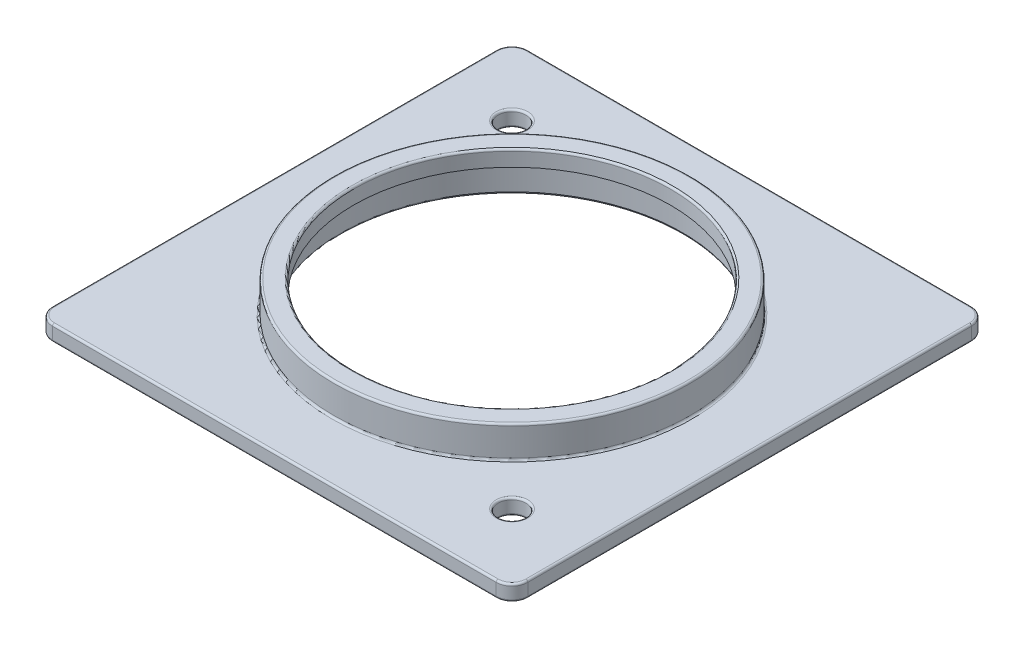
ISO-10303-21;
HEADER;
FILE_DESCRIPTION(('STEP AP214'),'2;1');
FILE_NAME('part.step','',(''),(''),'','','');
FILE_SCHEMA(('AUTOMOTIVE_DESIGN { 1 0 10303 214 1 1 1 1 }'));
ENDSEC;
DATA;
#1=APPLICATION_CONTEXT('core data for automotive mechanical design processes');
#2=APPLICATION_PROTOCOL_DEFINITION('international standard','automotive_design',2000,#1);
#3=PRODUCT_CONTEXT('',#1,'mechanical');
#4=PRODUCT('Part','Part','',(#3));
#5=PRODUCT_RELATED_PRODUCT_CATEGORY('part','',(#4));
#6=PRODUCT_DEFINITION_FORMATION('','',#4);
#7=PRODUCT_DEFINITION_CONTEXT('part definition',#1,'design');
#8=PRODUCT_DEFINITION('design','',#6,#7);
#9=PRODUCT_DEFINITION_SHAPE('','',#8);
#10=(LENGTH_UNIT() NAMED_UNIT(*) SI_UNIT(.MILLI.,.METRE.));
#11=(NAMED_UNIT(*) PLANE_ANGLE_UNIT() SI_UNIT($,.RADIAN.));
#12=(NAMED_UNIT(*) SI_UNIT($,.STERADIAN.) SOLID_ANGLE_UNIT());
#13=UNCERTAINTY_MEASURE_WITH_UNIT(LENGTH_MEASURE(1.E-05),#10,'distance_accuracy_value','');
#14=(GEOMETRIC_REPRESENTATION_CONTEXT(3) GLOBAL_UNCERTAINTY_ASSIGNED_CONTEXT((#13)) GLOBAL_UNIT_ASSIGNED_CONTEXT((#10,
#11,#12)) REPRESENTATION_CONTEXT('',''));
#15=CARTESIAN_POINT('',(0.,0.,0.));
#16=DIRECTION('',(0.,0.,1.));
#17=DIRECTION('',(1.,0.,0.));
#18=AXIS2_PLACEMENT_3D('',#15,#16,#17);
#19=CARTESIAN_POINT('',(0.,2.,0.));
#20=DIRECTION('',(0.,1.,0.));
#21=DIRECTION('',(0.,0.,1.));
#22=AXIS2_PLACEMENT_3D('',#19,#20,#21);
#23=PLANE('',#22);
#24=CARTESIAN_POINT('',(-21.2132034355966,2.,-21.2132034355962));
#25=DIRECTION('',(0.,1.,0.));
#26=DIRECTION('',(0.,0.,1.));
#27=AXIS2_PLACEMENT_3D('',#24,#25,#26);
#28=CIRCLE('',#27,2.00000000000002);
#29=CARTESIAN_POINT('',(-21.2132034355966,2.,-19.2132034355962));
#30=VERTEX_POINT('',#29);
#31=EDGE_CURVE('E259',#30,#30,#28,.F.);
#32=ORIENTED_EDGE('',*,*,#31,.T.);
#33=EDGE_LOOP('',(#32));
#34=FACE_BOUND('',#33,.T.);
#35=CARTESIAN_POINT('',(21.2132034355966,2.,21.2132034355962));
#36=DIRECTION('',(0.,1.,0.));
#37=DIRECTION('',(0.,0.,1.));
#38=AXIS2_PLACEMENT_3D('',#35,#36,#37);
#39=CIRCLE('',#38,2.);
#40=CARTESIAN_POINT('',(21.2132034355966,2.,23.2132034355962));
#41=VERTEX_POINT('',#40);
#42=EDGE_CURVE('E262',#41,#41,#39,.F.);
#43=ORIENTED_EDGE('',*,*,#42,.T.);
#44=EDGE_LOOP('',(#43));
#45=FACE_BOUND('',#44,.T.);
#46=CARTESIAN_POINT('',(0.,2.,0.));
#47=DIRECTION('',(0.,1.,0.));
#48=DIRECTION('',(0.,0.,1.));
#49=AXIS2_PLACEMENT_3D('',#46,#47,#48);
#50=CIRCLE('',#49,22.75);
#51=CARTESIAN_POINT('',(0.,2.,22.75));
#52=VERTEX_POINT('',#51);
#53=EDGE_CURVE('E357',#52,#52,#50,.F.);
#54=ORIENTED_EDGE('',*,*,#53,.T.);
#55=EDGE_LOOP('',(#54));
#56=FACE_BOUND('',#55,.T.);
#57=CARTESIAN_POINT('',(-28.,2.,28.));
#58=DIRECTION('',(0.,1.,0.));
#59=DIRECTION('',(0.,0.,1.));
#60=AXIS2_PLACEMENT_3D('',#57,#58,#59);
#61=CIRCLE('',#60,1.75);
#62=CARTESIAN_POINT('',(-28.,2.,29.75));
#63=VERTEX_POINT('',#62);
#64=CARTESIAN_POINT('',(-29.75,2.,28.));
#65=VERTEX_POINT('',#64);
#66=EDGE_CURVE('E260',#63,#65,#61,.F.);
#67=ORIENTED_EDGE('',*,*,#66,.F.);
#68=DIRECTION('',(1.,0.,0.));
#69=VECTOR('',#68,1.);
#70=CARTESIAN_POINT('',(30.,2.,29.75));
#71=LINE('',#70,#69);
#72=CARTESIAN_POINT('',(28.,2.,29.75));
#73=VERTEX_POINT('',#72);
#74=EDGE_CURVE('E250',#63,#73,#71,.T.);
#75=ORIENTED_EDGE('',*,*,#74,.T.);
#76=CARTESIAN_POINT('',(28.,2.,28.));
#77=DIRECTION('',(0.,1.,0.));
#78=DIRECTION('',(0.,0.,1.));
#79=AXIS2_PLACEMENT_3D('',#76,#77,#78);
#80=CIRCLE('',#79,1.75);
#81=CARTESIAN_POINT('',(29.75,2.,28.));
#82=VERTEX_POINT('',#81);
#83=EDGE_CURVE('E247',#82,#73,#80,.F.);
#84=ORIENTED_EDGE('',*,*,#83,.F.);
#85=DIRECTION('',(0.,0.,-1.));
#86=VECTOR('',#85,1.);
#87=CARTESIAN_POINT('',(29.75,2.,-30.));
#88=LINE('',#87,#86);
#89=CARTESIAN_POINT('',(29.75,2.,-28.));
#90=VERTEX_POINT('',#89);
#91=EDGE_CURVE('E256',#82,#90,#88,.T.);
#92=ORIENTED_EDGE('',*,*,#91,.T.);
#93=CARTESIAN_POINT('',(28.,2.,-28.));
#94=DIRECTION('',(0.,1.,0.));
#95=DIRECTION('',(0.,0.,1.));
#96=AXIS2_PLACEMENT_3D('',#93,#94,#95);
#97=CIRCLE('',#96,1.75);
#98=CARTESIAN_POINT('',(28.,2.,-29.75));
#99=VERTEX_POINT('',#98);
#100=EDGE_CURVE('E281',#99,#90,#97,.F.);
#101=ORIENTED_EDGE('',*,*,#100,.F.);
#102=DIRECTION('',(1.,0.,0.));
#103=VECTOR('',#102,1.);
#104=CARTESIAN_POINT('',(0.,2.,-29.75));
#105=LINE('',#104,#103);
#106=CARTESIAN_POINT('',(-28.,2.,-29.75));
#107=VERTEX_POINT('',#106);
#108=EDGE_CURVE('E261',#99,#107,#105,.F.);
#109=ORIENTED_EDGE('',*,*,#108,.T.);
#110=CARTESIAN_POINT('',(-28.,2.,-28.));
#111=DIRECTION('',(0.,1.,0.));
#112=DIRECTION('',(0.,0.,1.));
#113=AXIS2_PLACEMENT_3D('',#110,#111,#112);
#114=CIRCLE('',#113,1.75);
#115=CARTESIAN_POINT('',(-29.75,2.,-28.));
#116=VERTEX_POINT('',#115);
#117=EDGE_CURVE('E286',#116,#107,#114,.F.);
#118=ORIENTED_EDGE('',*,*,#117,.F.);
#119=DIRECTION('',(0.,0.,-1.));
#120=VECTOR('',#119,1.);
#121=CARTESIAN_POINT('',(-29.75,2.,0.));
#122=LINE('',#121,#120);
#123=EDGE_CURVE('E269',#116,#65,#122,.F.);
#124=ORIENTED_EDGE('',*,*,#123,.T.);
#125=EDGE_LOOP('',(#67,#75,#84,#92,#101,#109,#118,#124));
#126=FACE_BOUND('',#125,.T.);
#127=ADVANCED_FACE('F43',(#34,#45,#56,#126),#23,.T.);
#128=CARTESIAN_POINT('',(0.,0.,0.));
#129=DIRECTION('',(0.,1.,0.));
#130=DIRECTION('',(0.,0.,1.));
#131=AXIS2_PLACEMENT_3D('',#128,#129,#130);
#132=PLANE('',#131);
#133=CARTESIAN_POINT('',(-21.2132034355966,0.,-21.2132034355962));
#134=DIRECTION('',(0.,1.,0.));
#135=DIRECTION('',(0.,0.,1.));
#136=AXIS2_PLACEMENT_3D('',#133,#134,#135);
#137=CIRCLE('',#136,2.00000000000002);
#138=CARTESIAN_POINT('',(-21.2132034355966,0.,-19.2132034355962));
#139=VERTEX_POINT('',#138);
#140=EDGE_CURVE('E428',#139,#139,#137,.T.);
#141=ORIENTED_EDGE('',*,*,#140,.T.);
#142=EDGE_LOOP('',(#141));
#143=FACE_BOUND('',#142,.T.);
#144=CARTESIAN_POINT('',(21.2132034355966,0.,21.2132034355962));
#145=DIRECTION('',(0.,1.,0.));
#146=DIRECTION('',(0.,0.,1.));
#147=AXIS2_PLACEMENT_3D('',#144,#145,#146);
#148=CIRCLE('',#147,2.);
#149=CARTESIAN_POINT('',(21.2132034355966,0.,23.2132034355962));
#150=VERTEX_POINT('',#149);
#151=EDGE_CURVE('E433',#150,#150,#148,.T.);
#152=ORIENTED_EDGE('',*,*,#151,.T.);
#153=EDGE_LOOP('',(#152));
#154=FACE_BOUND('',#153,.T.);
#155=CARTESIAN_POINT('',(0.,0.,0.));
#156=DIRECTION('',(0.,1.,0.));
#157=DIRECTION('',(0.,0.,1.));
#158=AXIS2_PLACEMENT_3D('',#155,#156,#157);
#159=CIRCLE('',#158,21.75);
#160=CARTESIAN_POINT('',(0.,0.,21.75));
#161=VERTEX_POINT('',#160);
#162=EDGE_CURVE('E436',#161,#161,#159,.T.);
#163=ORIENTED_EDGE('',*,*,#162,.T.);
#164=EDGE_LOOP('',(#163));
#165=FACE_BOUND('',#164,.T.);
#166=CARTESIAN_POINT('',(-28.,0.,28.));
#167=DIRECTION('',(0.,1.,0.));
#168=DIRECTION('',(0.,0.,1.));
#169=AXIS2_PLACEMENT_3D('',#166,#167,#168);
#170=CIRCLE('',#169,1.75);
#171=CARTESIAN_POINT('',(-29.75,0.,28.));
#172=VERTEX_POINT('',#171);
#173=CARTESIAN_POINT('',(-28.,0.,29.75));
#174=VERTEX_POINT('',#173);
#175=EDGE_CURVE('E168',#172,#174,#170,.T.);
#176=ORIENTED_EDGE('',*,*,#175,.F.);
#177=DIRECTION('',(0.,0.,-1.));
#178=VECTOR('',#177,1.);
#179=CARTESIAN_POINT('',(-29.75,0.,-30.));
#180=LINE('',#179,#178);
#181=CARTESIAN_POINT('',(-29.75,0.,-28.));
#182=VERTEX_POINT('',#181);
#183=EDGE_CURVE('E164',#172,#182,#180,.T.);
#184=ORIENTED_EDGE('',*,*,#183,.T.);
#185=CARTESIAN_POINT('',(-28.,0.,-28.));
#186=DIRECTION('',(0.,1.,0.));
#187=DIRECTION('',(0.,0.,1.));
#188=AXIS2_PLACEMENT_3D('',#185,#186,#187);
#189=CIRCLE('',#188,1.75);
#190=CARTESIAN_POINT('',(-28.,0.,-29.75));
#191=VERTEX_POINT('',#190);
#192=EDGE_CURVE('E157',#191,#182,#189,.T.);
#193=ORIENTED_EDGE('',*,*,#192,.F.);
#194=DIRECTION('',(1.,0.,0.));
#195=VECTOR('',#194,1.);
#196=CARTESIAN_POINT('',(30.,0.,-29.75));
#197=LINE('',#196,#195);
#198=CARTESIAN_POINT('',(28.,0.,-29.75));
#199=VERTEX_POINT('',#198);
#200=EDGE_CURVE('E162',#191,#199,#197,.T.);
#201=ORIENTED_EDGE('',*,*,#200,.T.);
#202=CARTESIAN_POINT('',(28.,0.,-28.));
#203=DIRECTION('',(0.,1.,0.));
#204=DIRECTION('',(0.,0.,1.));
#205=AXIS2_PLACEMENT_3D('',#202,#203,#204);
#206=CIRCLE('',#205,1.75);
#207=CARTESIAN_POINT('',(29.75,0.,-28.));
#208=VERTEX_POINT('',#207);
#209=EDGE_CURVE('E173',#208,#199,#206,.T.);
#210=ORIENTED_EDGE('',*,*,#209,.F.);
#211=DIRECTION('',(0.,0.,-1.));
#212=VECTOR('',#211,1.);
#213=CARTESIAN_POINT('',(29.75,0.,0.));
#214=LINE('',#213,#212);
#215=CARTESIAN_POINT('',(29.75,0.,28.));
#216=VERTEX_POINT('',#215);
#217=EDGE_CURVE('E182',#208,#216,#214,.F.);
#218=ORIENTED_EDGE('',*,*,#217,.T.);
#219=CARTESIAN_POINT('',(28.,0.,28.));
#220=DIRECTION('',(0.,1.,0.));
#221=DIRECTION('',(0.,0.,1.));
#222=AXIS2_PLACEMENT_3D('',#219,#220,#221);
#223=CIRCLE('',#222,1.75);
#224=CARTESIAN_POINT('',(28.,0.,29.75));
#225=VERTEX_POINT('',#224);
#226=EDGE_CURVE('E275',#225,#216,#223,.T.);
#227=ORIENTED_EDGE('',*,*,#226,.F.);
#228=DIRECTION('',(1.,0.,0.));
#229=VECTOR('',#228,1.);
#230=CARTESIAN_POINT('',(0.,0.,29.75));
#231=LINE('',#230,#229);
#232=EDGE_CURVE('E424',#225,#174,#231,.F.);
#233=ORIENTED_EDGE('',*,*,#232,.T.);
#234=EDGE_LOOP('',(#176,#184,#193,#201,#210,#218,#227,#233));
#235=FACE_BOUND('',#234,.T.);
#236=ADVANCED_FACE('F165',(#143,#154,#165,#235),#132,.F.);
#237=CARTESIAN_POINT('',(0.,2.,30.));
#238=DIRECTION('',(0.,0.,-1.));
#239=DIRECTION('',(-1.,0.,0.));
#240=AXIS2_PLACEMENT_3D('',#237,#238,#239);
#241=PLANE('',#240);
#242=DIRECTION('',(1.,0.,0.));
#243=VECTOR('',#242,1.);
#244=CARTESIAN_POINT('',(0.,0.25,30.));
#245=LINE('',#244,#243);
#246=CARTESIAN_POINT('',(-28.,0.25,30.));
#247=VERTEX_POINT('',#246);
#248=CARTESIAN_POINT('',(28.,0.25,30.));
#249=VERTEX_POINT('',#248);
#250=EDGE_CURVE('E339',#247,#249,#245,.T.);
#251=ORIENTED_EDGE('',*,*,#250,.T.);
#252=DIRECTION('',(0.,-1.,0.));
#253=VECTOR('',#252,1.);
#254=CARTESIAN_POINT('',(28.,2.,30.));
#255=LINE('',#254,#253);
#256=CARTESIAN_POINT('',(28.,1.75,30.));
#257=VERTEX_POINT('',#256);
#258=EDGE_CURVE('E67',#249,#257,#255,.F.);
#259=ORIENTED_EDGE('',*,*,#258,.T.);
#260=DIRECTION('',(1.,0.,0.));
#261=VECTOR('',#260,1.);
#262=CARTESIAN_POINT('',(-30.,1.75,30.));
#263=LINE('',#262,#261);
#264=CARTESIAN_POINT('',(-28.,1.75,30.));
#265=VERTEX_POINT('',#264);
#266=EDGE_CURVE('E253',#257,#265,#263,.F.);
#267=ORIENTED_EDGE('',*,*,#266,.T.);
#268=DIRECTION('',(0.,-1.,0.));
#269=VECTOR('',#268,1.);
#270=CARTESIAN_POINT('',(-28.,0.25,30.));
#271=LINE('',#270,#269);
#272=EDGE_CURVE('E207',#265,#247,#271,.T.);
#273=ORIENTED_EDGE('',*,*,#272,.T.);
#274=EDGE_LOOP('',(#251,#259,#267,#273));
#275=FACE_BOUND('',#274,.T.);
#276=ADVANCED_FACE('F396',(#275),#241,.F.);
#277=CARTESIAN_POINT('',(30.,2.,0.));
#278=DIRECTION('',(-1.,0.,0.));
#279=DIRECTION('',(0.,0.,1.));
#280=AXIS2_PLACEMENT_3D('',#277,#278,#279);
#281=PLANE('',#280);
#282=DIRECTION('',(0.,0.,-1.));
#283=VECTOR('',#282,1.);
#284=CARTESIAN_POINT('',(30.,1.75,30.));
#285=LINE('',#284,#283);
#286=CARTESIAN_POINT('',(30.,1.75,-28.));
#287=VERTEX_POINT('',#286);
#288=CARTESIAN_POINT('',(30.,1.75,28.));
#289=VERTEX_POINT('',#288);
#290=EDGE_CURVE('E442',#287,#289,#285,.F.);
#291=ORIENTED_EDGE('',*,*,#290,.T.);
#292=DIRECTION('',(0.,-1.,0.));
#293=VECTOR('',#292,1.);
#294=CARTESIAN_POINT('',(30.,2.,28.));
#295=LINE('',#294,#293);
#296=CARTESIAN_POINT('',(30.,0.25,28.));
#297=VERTEX_POINT('',#296);
#298=EDGE_CURVE('E210',#289,#297,#295,.T.);
#299=ORIENTED_EDGE('',*,*,#298,.T.);
#300=DIRECTION('',(0.,0.,-1.));
#301=VECTOR('',#300,1.);
#302=CARTESIAN_POINT('',(30.,0.25,0.));
#303=LINE('',#302,#301);
#304=CARTESIAN_POINT('',(30.,0.25,-28.));
#305=VERTEX_POINT('',#304);
#306=EDGE_CURVE('E438',#297,#305,#303,.T.);
#307=ORIENTED_EDGE('',*,*,#306,.T.);
#308=DIRECTION('',(0.,-1.,0.));
#309=VECTOR('',#308,1.);
#310=CARTESIAN_POINT('',(30.,1.75,-28.));
#311=LINE('',#310,#309);
#312=EDGE_CURVE('E202',#305,#287,#311,.F.);
#313=ORIENTED_EDGE('',*,*,#312,.T.);
#314=EDGE_LOOP('',(#291,#299,#307,#313));
#315=FACE_BOUND('',#314,.T.);
#316=ADVANCED_FACE('F404',(#315),#281,.F.);
#317=CARTESIAN_POINT('',(0.,2.,-30.));
#318=DIRECTION('',(0.,0.,-1.));
#319=DIRECTION('',(-1.,0.,0.));
#320=AXIS2_PLACEMENT_3D('',#317,#318,#319);
#321=PLANE('',#320);
#322=DIRECTION('',(1.,0.,0.));
#323=VECTOR('',#322,1.);
#324=CARTESIAN_POINT('',(0.,1.75,-30.));
#325=LINE('',#324,#323);
#326=CARTESIAN_POINT('',(-28.,1.75,-30.));
#327=VERTEX_POINT('',#326);
#328=CARTESIAN_POINT('',(28.,1.75,-30.));
#329=VERTEX_POINT('',#328);
#330=EDGE_CURVE('E304',#327,#329,#325,.T.);
#331=ORIENTED_EDGE('',*,*,#330,.T.);
#332=DIRECTION('',(0.,-1.,0.));
#333=VECTOR('',#332,1.);
#334=CARTESIAN_POINT('',(28.,0.25,-30.));
#335=LINE('',#334,#333);
#336=CARTESIAN_POINT('',(28.,0.25,-30.));
#337=VERTEX_POINT('',#336);
#338=EDGE_CURVE('E212',#329,#337,#335,.T.);
#339=ORIENTED_EDGE('',*,*,#338,.T.);
#340=DIRECTION('',(1.,0.,0.));
#341=VECTOR('',#340,1.);
#342=CARTESIAN_POINT('',(-30.,0.25,-30.));
#343=LINE('',#342,#341);
#344=CARTESIAN_POINT('',(-28.,0.25,-30.));
#345=VERTEX_POINT('',#344);
#346=EDGE_CURVE('E313',#337,#345,#343,.F.);
#347=ORIENTED_EDGE('',*,*,#346,.T.);
#348=DIRECTION('',(0.,-1.,0.));
#349=VECTOR('',#348,1.);
#350=CARTESIAN_POINT('',(-28.,2.,-30.));
#351=LINE('',#350,#349);
#352=EDGE_CURVE('E215',#345,#327,#351,.F.);
#353=ORIENTED_EDGE('',*,*,#352,.T.);
#354=EDGE_LOOP('',(#331,#339,#347,#353));
#355=FACE_BOUND('',#354,.T.);
#356=ADVANCED_FACE('F306',(#355),#321,.T.);
#357=CARTESIAN_POINT('',(-21.2132034355966,2.,-21.2132034355962));
#358=DIRECTION('',(0.,-1.,0.));
#359=DIRECTION('',(0.,0.,-1.));
#360=AXIS2_PLACEMENT_3D('',#357,#358,#359);
#361=CYLINDRICAL_SURFACE('',#360,1.75000000000002);
#362=CARTESIAN_POINT('',(-21.2132034355966,0.25,-21.2132034355962));
#363=DIRECTION('',(0.,1.,0.));
#364=DIRECTION('',(0.,0.,1.));
#365=AXIS2_PLACEMENT_3D('',#362,#363,#364);
#366=CIRCLE('',#365,1.75000000000002);
#367=CARTESIAN_POINT('',(-21.2132034355966,0.25,-19.4632034355962));
#368=VERTEX_POINT('',#367);
#369=EDGE_CURVE('E345',#368,#368,#366,.F.);
#370=ORIENTED_EDGE('',*,*,#369,.T.);
#371=EDGE_LOOP('',(#370));
#372=FACE_BOUND('',#371,.T.);
#373=CARTESIAN_POINT('',(-21.2132034355966,1.75,-21.2132034355962));
#374=DIRECTION('',(0.,1.,0.));
#375=DIRECTION('',(0.,0.,1.));
#376=AXIS2_PLACEMENT_3D('',#373,#374,#375);
#377=CIRCLE('',#376,1.75000000000002);
#378=CARTESIAN_POINT('',(-21.2132034355966,1.75,-19.4632034355962));
#379=VERTEX_POINT('',#378);
#380=EDGE_CURVE('E342',#379,#379,#377,.T.);
#381=ORIENTED_EDGE('',*,*,#380,.T.);
#382=EDGE_LOOP('',(#381));
#383=FACE_BOUND('',#382,.T.);
#384=ADVANCED_FACE('F374',(#372,#383),#361,.F.);
#385=CARTESIAN_POINT('',(21.2132034355966,2.,21.2132034355962));
#386=DIRECTION('',(0.,-1.,0.));
#387=DIRECTION('',(0.,0.,-1.));
#388=AXIS2_PLACEMENT_3D('',#385,#386,#387);
#389=CYLINDRICAL_SURFACE('',#388,1.75);
#390=CARTESIAN_POINT('',(21.2132034355966,0.25,21.2132034355962));
#391=DIRECTION('',(0.,1.,0.));
#392=DIRECTION('',(0.,0.,1.));
#393=AXIS2_PLACEMENT_3D('',#390,#391,#392);
#394=CIRCLE('',#393,1.75);
#395=CARTESIAN_POINT('',(21.2132034355966,0.25,22.9632034355962));
#396=VERTEX_POINT('',#395);
#397=EDGE_CURVE('E353',#396,#396,#394,.F.);
#398=ORIENTED_EDGE('',*,*,#397,.T.);
#399=EDGE_LOOP('',(#398));
#400=FACE_BOUND('',#399,.T.);
#401=CARTESIAN_POINT('',(21.2132034355966,1.75,21.2132034355962));
#402=DIRECTION('',(0.,1.,0.));
#403=DIRECTION('',(0.,0.,1.));
#404=AXIS2_PLACEMENT_3D('',#401,#402,#403);
#405=CIRCLE('',#404,1.75);
#406=CARTESIAN_POINT('',(21.2132034355966,1.75,22.9632034355962));
#407=VERTEX_POINT('',#406);
#408=EDGE_CURVE('E346',#407,#407,#405,.T.);
#409=ORIENTED_EDGE('',*,*,#408,.T.);
#410=EDGE_LOOP('',(#409));
#411=FACE_BOUND('',#410,.T.);
#412=ADVANCED_FACE('F375',(#400,#411),#389,.F.);
#413=CARTESIAN_POINT('',(-30.,2.,0.));
#414=DIRECTION('',(-1.,0.,0.));
#415=DIRECTION('',(0.,0.,1.));
#416=AXIS2_PLACEMENT_3D('',#413,#414,#415);
#417=PLANE('',#416);
#418=DIRECTION('',(0.,0.,-1.));
#419=VECTOR('',#418,1.);
#420=CARTESIAN_POINT('',(-30.,1.75,0.));
#421=LINE('',#420,#419);
#422=CARTESIAN_POINT('',(-30.,1.75,28.));
#423=VERTEX_POINT('',#422);
#424=CARTESIAN_POINT('',(-30.,1.75,-28.));
#425=VERTEX_POINT('',#424);
#426=EDGE_CURVE('E334',#423,#425,#421,.T.);
#427=ORIENTED_EDGE('',*,*,#426,.T.);
#428=DIRECTION('',(0.,-1.,0.));
#429=VECTOR('',#428,1.);
#430=CARTESIAN_POINT('',(-30.,2.,-28.));
#431=LINE('',#430,#429);
#432=CARTESIAN_POINT('',(-30.,0.25,-28.));
#433=VERTEX_POINT('',#432);
#434=EDGE_CURVE('E11',#425,#433,#431,.T.);
#435=ORIENTED_EDGE('',*,*,#434,.T.);
#436=DIRECTION('',(0.,0.,-1.));
#437=VECTOR('',#436,1.);
#438=CARTESIAN_POINT('',(-30.,0.25,30.));
#439=LINE('',#438,#437);
#440=CARTESIAN_POINT('',(-30.,0.25,28.));
#441=VERTEX_POINT('',#440);
#442=EDGE_CURVE('E338',#433,#441,#439,.F.);
#443=ORIENTED_EDGE('',*,*,#442,.T.);
#444=DIRECTION('',(0.,-1.,0.));
#445=VECTOR('',#444,1.);
#446=CARTESIAN_POINT('',(-30.,1.75,28.));
#447=LINE('',#446,#445);
#448=EDGE_CURVE('E55',#441,#423,#447,.F.);
#449=ORIENTED_EDGE('',*,*,#448,.T.);
#450=EDGE_LOOP('',(#427,#435,#443,#449));
#451=FACE_BOUND('',#450,.T.);
#452=ADVANCED_FACE('F372',(#451),#417,.T.);
#453=CARTESIAN_POINT('',(0.,6.,0.));
#454=DIRECTION('',(0.,-1.,0.));
#455=DIRECTION('',(0.,0.,-1.));
#456=AXIS2_PLACEMENT_3D('',#453,#454,#455);
#457=CYLINDRICAL_SURFACE('',#456,20.);
#458=CARTESIAN_POINT('',(0.,5.75,0.));
#459=DIRECTION('',(0.,1.,0.));
#460=DIRECTION('',(0.,0.,1.));
#461=AXIS2_PLACEMENT_3D('',#458,#459,#460);
#462=CIRCLE('',#461,20.);
#463=CARTESIAN_POINT('',(0.,5.75,20.));
#464=VERTEX_POINT('',#463);
#465=EDGE_CURVE('E441',#464,#464,#462,.T.);
#466=ORIENTED_EDGE('',*,*,#465,.T.);
#467=EDGE_LOOP('',(#466));
#468=FACE_BOUND('',#467,.T.);
#469=CARTESIAN_POINT('',(0.,4.,0.));
#470=DIRECTION('',(0.,1.,0.));
#471=DIRECTION('',(0.,0.,1.));
#472=AXIS2_PLACEMENT_3D('',#469,#470,#471);
#473=CIRCLE('',#472,20.);
#474=CARTESIAN_POINT('',(0.,4.,20.));
#475=VERTEX_POINT('',#474);
#476=EDGE_CURVE('E221',#475,#475,#473,.T.);
#477=ORIENTED_EDGE('',*,*,#476,.F.);
#478=EDGE_LOOP('',(#477));
#479=FACE_BOUND('',#478,.T.);
#480=ADVANCED_FACE('F382',(#468,#479),#457,.F.);
#481=CARTESIAN_POINT('',(0.,6.,0.));
#482=DIRECTION('',(0.,-1.,0.));
#483=DIRECTION('',(0.,0.,-1.));
#484=AXIS2_PLACEMENT_3D('',#481,#482,#483);
#485=CYLINDRICAL_SURFACE('',#484,22.5);
#486=CARTESIAN_POINT('',(0.,5.75,0.));
#487=DIRECTION('',(0.,1.,0.));
#488=DIRECTION('',(0.,0.,1.));
#489=AXIS2_PLACEMENT_3D('',#486,#487,#488);
#490=CIRCLE('',#489,22.5);
#491=CARTESIAN_POINT('',(0.,5.75,22.5));
#492=VERTEX_POINT('',#491);
#493=EDGE_CURVE('E450',#492,#492,#490,.F.);
#494=ORIENTED_EDGE('',*,*,#493,.T.);
#495=EDGE_LOOP('',(#494));
#496=FACE_BOUND('',#495,.T.);
#497=CARTESIAN_POINT('',(0.,2.25,0.));
#498=DIRECTION('',(0.,1.,0.));
#499=DIRECTION('',(0.,0.,1.));
#500=AXIS2_PLACEMENT_3D('',#497,#498,#499);
#501=CIRCLE('',#500,22.5);
#502=CARTESIAN_POINT('',(0.,2.25,22.5));
#503=VERTEX_POINT('',#502);
#504=EDGE_CURVE('E449',#503,#503,#501,.T.);
#505=ORIENTED_EDGE('',*,*,#504,.T.);
#506=EDGE_LOOP('',(#505));
#507=FACE_BOUND('',#506,.T.);
#508=ADVANCED_FACE('F469',(#496,#507),#485,.T.);
#509=CARTESIAN_POINT('',(0.,6.,0.));
#510=DIRECTION('',(0.,1.,0.));
#511=DIRECTION('',(0.,0.,1.));
#512=AXIS2_PLACEMENT_3D('',#509,#510,#511);
#513=PLANE('',#512);
#514=CARTESIAN_POINT('',(0.,6.,0.));
#515=DIRECTION('',(0.,1.,0.));
#516=DIRECTION('',(0.,0.,1.));
#517=AXIS2_PLACEMENT_3D('',#514,#515,#516);
#518=CIRCLE('',#517,22.25);
#519=CARTESIAN_POINT('',(0.,6.,22.25));
#520=VERTEX_POINT('',#519);
#521=EDGE_CURVE('E454',#520,#520,#518,.T.);
#522=ORIENTED_EDGE('',*,*,#521,.T.);
#523=EDGE_LOOP('',(#522));
#524=FACE_BOUND('',#523,.T.);
#525=CARTESIAN_POINT('',(0.,6.,0.));
#526=DIRECTION('',(0.,1.,0.));
#527=DIRECTION('',(0.,0.,1.));
#528=AXIS2_PLACEMENT_3D('',#525,#526,#527);
#529=CIRCLE('',#528,20.25);
#530=CARTESIAN_POINT('',(0.,6.,20.25));
#531=VERTEX_POINT('',#530);
#532=EDGE_CURVE('E457',#531,#531,#529,.F.);
#533=ORIENTED_EDGE('',*,*,#532,.T.);
#534=EDGE_LOOP('',(#533));
#535=FACE_BOUND('',#534,.T.);
#536=ADVANCED_FACE('F471',(#524,#535),#513,.T.);
#537=CARTESIAN_POINT('',(0.,4.,0.));
#538=DIRECTION('',(0.,-1.,0.));
#539=DIRECTION('',(0.,0.,-1.));
#540=AXIS2_PLACEMENT_3D('',#537,#538,#539);
#541=CYLINDRICAL_SURFACE('',#540,21.5);
#542=CARTESIAN_POINT('',(0.,0.25,0.));
#543=DIRECTION('',(0.,1.,0.));
#544=DIRECTION('',(0.,0.,1.));
#545=AXIS2_PLACEMENT_3D('',#542,#543,#544);
#546=CIRCLE('',#545,21.5);
#547=CARTESIAN_POINT('',(0.,0.25,21.5));
#548=VERTEX_POINT('',#547);
#549=EDGE_CURVE('E352',#548,#548,#546,.F.);
#550=ORIENTED_EDGE('',*,*,#549,.T.);
#551=EDGE_LOOP('',(#550));
#552=FACE_BOUND('',#551,.T.);
#553=CARTESIAN_POINT('',(0.,4.,0.));
#554=DIRECTION('',(0.,1.,0.));
#555=DIRECTION('',(0.,0.,1.));
#556=AXIS2_PLACEMENT_3D('',#553,#554,#555);
#557=CIRCLE('',#556,21.5);
#558=CARTESIAN_POINT('',(0.,4.,21.5));
#559=VERTEX_POINT('',#558);
#560=EDGE_CURVE('E459',#559,#559,#557,.T.);
#561=ORIENTED_EDGE('',*,*,#560,.T.);
#562=EDGE_LOOP('',(#561));
#563=FACE_BOUND('',#562,.T.);
#564=ADVANCED_FACE('F691',(#552,#563),#541,.F.);
#565=CARTESIAN_POINT('',(0.,4.,0.));
#566=DIRECTION('',(0.,1.,0.));
#567=DIRECTION('',(0.,0.,1.));
#568=AXIS2_PLACEMENT_3D('',#565,#566,#567);
#569=PLANE('',#568);
#570=ORIENTED_EDGE('',*,*,#476,.T.);
#571=EDGE_LOOP('',(#570));
#572=FACE_BOUND('',#571,.T.);
#573=ORIENTED_EDGE('',*,*,#560,.F.);
#574=EDGE_LOOP('',(#573));
#575=FACE_BOUND('',#574,.T.);
#576=ADVANCED_FACE('F464',(#572,#575),#569,.F.);
#577=CARTESIAN_POINT('',(0.,5.75,0.));
#578=DIRECTION('',(0.,1.,0.));
#579=DIRECTION('',(0.,0.,1.));
#580=AXIS2_PLACEMENT_3D('',#577,#578,#579);
#581=TOROIDAL_SURFACE('',#580,22.25,0.25);
#582=ORIENTED_EDGE('',*,*,#493,.F.);
#583=EDGE_LOOP('',(#582));
#584=FACE_BOUND('',#583,.T.);
#585=ORIENTED_EDGE('',*,*,#521,.F.);
#586=EDGE_LOOP('',(#585));
#587=FACE_BOUND('',#586,.T.);
#588=ADVANCED_FACE('F479',(#584,#587),#581,.T.);
#589=CARTESIAN_POINT('',(0.,5.75,0.));
#590=DIRECTION('',(0.,1.,0.));
#591=DIRECTION('',(0.,0.,1.));
#592=AXIS2_PLACEMENT_3D('',#589,#590,#591);
#593=TOROIDAL_SURFACE('',#592,20.25,0.25);
#594=ORIENTED_EDGE('',*,*,#532,.F.);
#595=EDGE_LOOP('',(#594));
#596=FACE_BOUND('',#595,.T.);
#597=ORIENTED_EDGE('',*,*,#465,.F.);
#598=EDGE_LOOP('',(#597));
#599=FACE_BOUND('',#598,.T.);
#600=ADVANCED_FACE('F480',(#596,#599),#593,.T.);
#601=CARTESIAN_POINT('',(-29.75,0.25,0.));
#602=DIRECTION('',(0.,0.,1.));
#603=DIRECTION('',(1.,0.,0.));
#604=AXIS2_PLACEMENT_3D('',#601,#602,#603);
#605=CYLINDRICAL_SURFACE('',#604,0.25);
#606=ORIENTED_EDGE('',*,*,#442,.F.);
#607=CARTESIAN_POINT('',(-29.75,0.25,-28.));
#608=DIRECTION('',(0.,0.,1.));
#609=DIRECTION('',(1.,0.,0.));
#610=AXIS2_PLACEMENT_3D('',#607,#608,#609);
#611=CIRCLE('',#610,0.25);
#612=EDGE_CURVE('E298',#433,#182,#611,.T.);
#613=ORIENTED_EDGE('',*,*,#612,.T.);
#614=ORIENTED_EDGE('',*,*,#183,.F.);
#615=CARTESIAN_POINT('',(-29.75,0.25,28.));
#616=DIRECTION('',(0.,0.,-1.));
#617=DIRECTION('',(-1.,0.,0.));
#618=AXIS2_PLACEMENT_3D('',#615,#616,#617);
#619=CIRCLE('',#618,0.25);
#620=EDGE_CURVE('E294',#172,#441,#619,.T.);
#621=ORIENTED_EDGE('',*,*,#620,.T.);
#622=EDGE_LOOP('',(#606,#613,#614,#621));
#623=FACE_BOUND('',#622,.T.);
#624=ADVANCED_FACE('F430',(#623),#605,.T.);
#625=CARTESIAN_POINT('',(0.,0.25,29.75));
#626=DIRECTION('',(1.,0.,0.));
#627=DIRECTION('',(0.,0.,-1.));
#628=AXIS2_PLACEMENT_3D('',#625,#626,#627);
#629=CYLINDRICAL_SURFACE('',#628,0.25);
#630=ORIENTED_EDGE('',*,*,#250,.F.);
#631=CARTESIAN_POINT('',(-28.,0.25,29.75));
#632=DIRECTION('',(1.,0.,0.));
#633=DIRECTION('',(0.,0.,-1.));
#634=AXIS2_PLACEMENT_3D('',#631,#632,#633);
#635=CIRCLE('',#634,0.25);
#636=EDGE_CURVE('E278',#247,#174,#635,.T.);
#637=ORIENTED_EDGE('',*,*,#636,.T.);
#638=ORIENTED_EDGE('',*,*,#232,.F.);
#639=CARTESIAN_POINT('',(28.,0.25,29.75));
#640=DIRECTION('',(-1.,0.,0.));
#641=DIRECTION('',(0.,0.,1.));
#642=AXIS2_PLACEMENT_3D('',#639,#640,#641);
#643=CIRCLE('',#642,0.25);
#644=EDGE_CURVE('E279',#225,#249,#643,.T.);
#645=ORIENTED_EDGE('',*,*,#644,.T.);
#646=EDGE_LOOP('',(#630,#637,#638,#645));
#647=FACE_BOUND('',#646,.T.);
#648=ADVANCED_FACE('F415',(#647),#629,.T.);
#649=CARTESIAN_POINT('',(0.,0.25,-29.75));
#650=DIRECTION('',(-1.,0.,0.));
#651=DIRECTION('',(0.,0.,1.));
#652=AXIS2_PLACEMENT_3D('',#649,#650,#651);
#653=CYLINDRICAL_SURFACE('',#652,0.25);
#654=ORIENTED_EDGE('',*,*,#346,.F.);
#655=CARTESIAN_POINT('',(28.,0.25,-29.75));
#656=DIRECTION('',(-1.,0.,0.));
#657=DIRECTION('',(0.,0.,1.));
#658=AXIS2_PLACEMENT_3D('',#655,#656,#657);
#659=CIRCLE('',#658,0.25);
#660=EDGE_CURVE('E180',#337,#199,#659,.T.);
#661=ORIENTED_EDGE('',*,*,#660,.T.);
#662=ORIENTED_EDGE('',*,*,#200,.F.);
#663=CARTESIAN_POINT('',(-28.,0.25,-29.75));
#664=DIRECTION('',(1.,0.,0.));
#665=DIRECTION('',(0.,0.,-1.));
#666=AXIS2_PLACEMENT_3D('',#663,#664,#665);
#667=CIRCLE('',#666,0.25);
#668=EDGE_CURVE('E177',#191,#345,#667,.T.);
#669=ORIENTED_EDGE('',*,*,#668,.T.);
#670=EDGE_LOOP('',(#654,#661,#662,#669));
#671=FACE_BOUND('',#670,.T.);
#672=ADVANCED_FACE('F176',(#671),#653,.T.);
#673=CARTESIAN_POINT('',(29.75,0.25,0.));
#674=DIRECTION('',(0.,0.,-1.));
#675=DIRECTION('',(-1.,0.,0.));
#676=AXIS2_PLACEMENT_3D('',#673,#674,#675);
#677=CYLINDRICAL_SURFACE('',#676,0.25);
#678=ORIENTED_EDGE('',*,*,#306,.F.);
#679=CARTESIAN_POINT('',(29.75,0.25,28.));
#680=DIRECTION('',(0.,0.,-1.));
#681=DIRECTION('',(-1.,0.,0.));
#682=AXIS2_PLACEMENT_3D('',#679,#680,#681);
#683=CIRCLE('',#682,0.25);
#684=EDGE_CURVE('E199',#297,#216,#683,.T.);
#685=ORIENTED_EDGE('',*,*,#684,.T.);
#686=ORIENTED_EDGE('',*,*,#217,.F.);
#687=CARTESIAN_POINT('',(29.75,0.25,-28.));
#688=DIRECTION('',(0.,0.,1.));
#689=DIRECTION('',(1.,0.,0.));
#690=AXIS2_PLACEMENT_3D('',#687,#688,#689);
#691=CIRCLE('',#690,0.25);
#692=EDGE_CURVE('E196',#208,#305,#691,.T.);
#693=ORIENTED_EDGE('',*,*,#692,.T.);
#694=EDGE_LOOP('',(#678,#685,#686,#693));
#695=FACE_BOUND('',#694,.T.);
#696=ADVANCED_FACE('F330',(#695),#677,.T.);
#697=CARTESIAN_POINT('',(-21.2132034355966,0.25,-21.2132034355962));
#698=DIRECTION('',(0.,1.,0.));
#699=DIRECTION('',(0.,0.,1.));
#700=AXIS2_PLACEMENT_3D('',#697,#698,#699);
#701=TOROIDAL_SURFACE('',#700,2.00000000000002,0.25);
#702=ORIENTED_EDGE('',*,*,#369,.F.);
#703=EDGE_LOOP('',(#702));
#704=FACE_BOUND('',#703,.T.);
#705=ORIENTED_EDGE('',*,*,#140,.F.);
#706=EDGE_LOOP('',(#705));
#707=FACE_BOUND('',#706,.T.);
#708=ADVANCED_FACE('F492',(#704,#707),#701,.T.);
#709=CARTESIAN_POINT('',(21.2132034355966,0.25,21.2132034355962));
#710=DIRECTION('',(0.,1.,0.));
#711=DIRECTION('',(0.,0.,1.));
#712=AXIS2_PLACEMENT_3D('',#709,#710,#711);
#713=TOROIDAL_SURFACE('',#712,2.,0.25);
#714=ORIENTED_EDGE('',*,*,#397,.F.);
#715=EDGE_LOOP('',(#714));
#716=FACE_BOUND('',#715,.T.);
#717=ORIENTED_EDGE('',*,*,#151,.F.);
#718=EDGE_LOOP('',(#717));
#719=FACE_BOUND('',#718,.T.);
#720=ADVANCED_FACE('F496',(#716,#719),#713,.T.);
#721=CARTESIAN_POINT('',(0.,0.25,0.));
#722=DIRECTION('',(0.,1.,0.));
#723=DIRECTION('',(0.,0.,1.));
#724=AXIS2_PLACEMENT_3D('',#721,#722,#723);
#725=TOROIDAL_SURFACE('',#724,21.75,0.25);
#726=ORIENTED_EDGE('',*,*,#549,.F.);
#727=EDGE_LOOP('',(#726));
#728=FACE_BOUND('',#727,.T.);
#729=ORIENTED_EDGE('',*,*,#162,.F.);
#730=EDGE_LOOP('',(#729));
#731=FACE_BOUND('',#730,.T.);
#732=ADVANCED_FACE('F501',(#728,#731),#725,.T.);
#733=CARTESIAN_POINT('',(29.75,1.75,0.));
#734=DIRECTION('',(0.,0.,1.));
#735=DIRECTION('',(1.,0.,0.));
#736=AXIS2_PLACEMENT_3D('',#733,#734,#735);
#737=CYLINDRICAL_SURFACE('',#736,0.25);
#738=ORIENTED_EDGE('',*,*,#290,.F.);
#739=CARTESIAN_POINT('',(29.75,1.75,-28.));
#740=DIRECTION('',(0.,0.,1.));
#741=DIRECTION('',(1.,0.,0.));
#742=AXIS2_PLACEMENT_3D('',#739,#740,#741);
#743=CIRCLE('',#742,0.25);
#744=EDGE_CURVE('E198',#287,#90,#743,.T.);
#745=ORIENTED_EDGE('',*,*,#744,.T.);
#746=ORIENTED_EDGE('',*,*,#91,.F.);
#747=CARTESIAN_POINT('',(29.75,1.75,28.));
#748=DIRECTION('',(0.,0.,-1.));
#749=DIRECTION('',(-1.,0.,0.));
#750=AXIS2_PLACEMENT_3D('',#747,#748,#749);
#751=CIRCLE('',#750,0.25);
#752=EDGE_CURVE('E187',#82,#289,#751,.T.);
#753=ORIENTED_EDGE('',*,*,#752,.T.);
#754=EDGE_LOOP('',(#738,#745,#746,#753));
#755=FACE_BOUND('',#754,.T.);
#756=ADVANCED_FACE('F507',(#755),#737,.T.);
#757=CARTESIAN_POINT('',(0.,1.75,29.75));
#758=DIRECTION('',(-1.,0.,0.));
#759=DIRECTION('',(0.,0.,1.));
#760=AXIS2_PLACEMENT_3D('',#757,#758,#759);
#761=CYLINDRICAL_SURFACE('',#760,0.25);
#762=ORIENTED_EDGE('',*,*,#266,.F.);
#763=CARTESIAN_POINT('',(28.,1.75,29.75));
#764=DIRECTION('',(-1.,0.,0.));
#765=DIRECTION('',(0.,0.,1.));
#766=AXIS2_PLACEMENT_3D('',#763,#764,#765);
#767=CIRCLE('',#766,0.25);
#768=EDGE_CURVE('E201',#257,#73,#767,.T.);
#769=ORIENTED_EDGE('',*,*,#768,.T.);
#770=ORIENTED_EDGE('',*,*,#74,.F.);
#771=CARTESIAN_POINT('',(-28.,1.75,29.75));
#772=DIRECTION('',(1.,0.,0.));
#773=DIRECTION('',(0.,0.,-1.));
#774=AXIS2_PLACEMENT_3D('',#771,#772,#773);
#775=CIRCLE('',#774,0.25);
#776=EDGE_CURVE('E58',#63,#265,#775,.T.);
#777=ORIENTED_EDGE('',*,*,#776,.T.);
#778=EDGE_LOOP('',(#762,#769,#770,#777));
#779=FACE_BOUND('',#778,.T.);
#780=ADVANCED_FACE('F248',(#779),#761,.T.);
#781=CARTESIAN_POINT('',(0.,1.75,-29.75));
#782=DIRECTION('',(1.,0.,0.));
#783=DIRECTION('',(0.,0.,-1.));
#784=AXIS2_PLACEMENT_3D('',#781,#782,#783);
#785=CYLINDRICAL_SURFACE('',#784,0.25);
#786=ORIENTED_EDGE('',*,*,#330,.F.);
#787=CARTESIAN_POINT('',(-28.,1.75,-29.75));
#788=DIRECTION('',(1.,0.,0.));
#789=DIRECTION('',(0.,0.,-1.));
#790=AXIS2_PLACEMENT_3D('',#787,#788,#789);
#791=CIRCLE('',#790,0.25);
#792=EDGE_CURVE('E190',#327,#107,#791,.T.);
#793=ORIENTED_EDGE('',*,*,#792,.T.);
#794=ORIENTED_EDGE('',*,*,#108,.F.);
#795=CARTESIAN_POINT('',(28.,1.75,-29.75));
#796=DIRECTION('',(-1.,0.,0.));
#797=DIRECTION('',(0.,0.,1.));
#798=AXIS2_PLACEMENT_3D('',#795,#796,#797);
#799=CIRCLE('',#798,0.25);
#800=EDGE_CURVE('E191',#99,#329,#799,.T.);
#801=ORIENTED_EDGE('',*,*,#800,.T.);
#802=EDGE_LOOP('',(#786,#793,#794,#801));
#803=FACE_BOUND('',#802,.T.);
#804=ADVANCED_FACE('F302',(#803),#785,.T.);
#805=CARTESIAN_POINT('',(-29.75,1.75,0.));
#806=DIRECTION('',(0.,0.,-1.));
#807=DIRECTION('',(-1.,0.,0.));
#808=AXIS2_PLACEMENT_3D('',#805,#806,#807);
#809=CYLINDRICAL_SURFACE('',#808,0.25);
#810=ORIENTED_EDGE('',*,*,#426,.F.);
#811=CARTESIAN_POINT('',(-29.75,1.75,28.));
#812=DIRECTION('',(0.,0.,-1.));
#813=DIRECTION('',(-1.,0.,0.));
#814=AXIS2_PLACEMENT_3D('',#811,#812,#813);
#815=CIRCLE('',#814,0.25);
#816=EDGE_CURVE('E295',#423,#65,#815,.T.);
#817=ORIENTED_EDGE('',*,*,#816,.T.);
#818=ORIENTED_EDGE('',*,*,#123,.F.);
#819=CARTESIAN_POINT('',(-29.75,1.75,-28.));
#820=DIRECTION('',(0.,0.,1.));
#821=DIRECTION('',(1.,0.,0.));
#822=AXIS2_PLACEMENT_3D('',#819,#820,#821);
#823=CIRCLE('',#822,0.25);
#824=EDGE_CURVE('E290',#116,#425,#823,.T.);
#825=ORIENTED_EDGE('',*,*,#824,.T.);
#826=EDGE_LOOP('',(#810,#817,#818,#825));
#827=FACE_BOUND('',#826,.T.);
#828=ADVANCED_FACE('F508',(#827),#809,.T.);
#829=CARTESIAN_POINT('',(-21.2132034355966,1.75,-21.2132034355962));
#830=DIRECTION('',(0.,1.,0.));
#831=DIRECTION('',(0.,0.,1.));
#832=AXIS2_PLACEMENT_3D('',#829,#830,#831);
#833=TOROIDAL_SURFACE('',#832,2.00000000000002,0.25);
#834=ORIENTED_EDGE('',*,*,#31,.F.);
#835=EDGE_LOOP('',(#834));
#836=FACE_BOUND('',#835,.T.);
#837=ORIENTED_EDGE('',*,*,#380,.F.);
#838=EDGE_LOOP('',(#837));
#839=FACE_BOUND('',#838,.T.);
#840=ADVANCED_FACE('F366',(#836,#839),#833,.T.);
#841=CARTESIAN_POINT('',(21.2132034355966,1.75,21.2132034355962));
#842=DIRECTION('',(0.,1.,0.));
#843=DIRECTION('',(0.,0.,1.));
#844=AXIS2_PLACEMENT_3D('',#841,#842,#843);
#845=TOROIDAL_SURFACE('',#844,2.,0.25);
#846=ORIENTED_EDGE('',*,*,#42,.F.);
#847=EDGE_LOOP('',(#846));
#848=FACE_BOUND('',#847,.T.);
#849=ORIENTED_EDGE('',*,*,#408,.F.);
#850=EDGE_LOOP('',(#849));
#851=FACE_BOUND('',#850,.T.);
#852=ADVANCED_FACE('F365',(#848,#851),#845,.T.);
#853=CARTESIAN_POINT('',(0.,2.25,0.));
#854=DIRECTION('',(0.,1.,0.));
#855=DIRECTION('',(0.,0.,1.));
#856=AXIS2_PLACEMENT_3D('',#853,#854,#855);
#857=TOROIDAL_SURFACE('',#856,22.75,0.25);
#858=ORIENTED_EDGE('',*,*,#53,.F.);
#859=EDGE_LOOP('',(#858));
#860=FACE_BOUND('',#859,.T.);
#861=ORIENTED_EDGE('',*,*,#504,.F.);
#862=EDGE_LOOP('',(#861));
#863=FACE_BOUND('',#862,.T.);
#864=ADVANCED_FACE('F370',(#860,#863),#857,.F.);
#865=CARTESIAN_POINT('',(-28.,1.75,28.));
#866=DIRECTION('',(0.,1.,0.));
#867=DIRECTION('',(0.,0.,1.));
#868=AXIS2_PLACEMENT_3D('',#865,#866,#867);
#869=TOROIDAL_SURFACE('',#868,1.75,0.25);
#870=ORIENTED_EDGE('',*,*,#66,.T.);
#871=ORIENTED_EDGE('',*,*,#816,.F.);
#872=CARTESIAN_POINT('',(-28.,1.75,28.));
#873=DIRECTION('',(0.,1.,0.));
#874=DIRECTION('',(0.,0.,1.));
#875=AXIS2_PLACEMENT_3D('',#872,#873,#874);
#876=CIRCLE('',#875,2.);
#877=EDGE_CURVE('E219',#265,#423,#876,.F.);
#878=ORIENTED_EDGE('',*,*,#877,.F.);
#879=ORIENTED_EDGE('',*,*,#776,.F.);
#880=EDGE_LOOP('',(#870,#871,#878,#879));
#881=FACE_BOUND('',#880,.T.);
#882=ADVANCED_FACE('F523',(#881),#869,.T.);
#883=CARTESIAN_POINT('',(-28.,2.,28.));
#884=DIRECTION('',(0.,1.,0.));
#885=DIRECTION('',(0.,0.,1.));
#886=AXIS2_PLACEMENT_3D('',#883,#884,#885);
#887=CYLINDRICAL_SURFACE('',#886,2.);
#888=ORIENTED_EDGE('',*,*,#877,.T.);
#889=ORIENTED_EDGE('',*,*,#448,.F.);
#890=CARTESIAN_POINT('',(-28.,0.25,28.));
#891=DIRECTION('',(0.,1.,0.));
#892=DIRECTION('',(0.,0.,1.));
#893=AXIS2_PLACEMENT_3D('',#890,#891,#892);
#894=CIRCLE('',#893,2.);
#895=EDGE_CURVE('E220',#247,#441,#894,.F.);
#896=ORIENTED_EDGE('',*,*,#895,.F.);
#897=ORIENTED_EDGE('',*,*,#272,.F.);
#898=EDGE_LOOP('',(#888,#889,#896,#897));
#899=FACE_BOUND('',#898,.T.);
#900=ADVANCED_FACE('F423',(#899),#887,.T.);
#901=CARTESIAN_POINT('',(-28.,0.25,28.));
#902=DIRECTION('',(0.,1.,0.));
#903=DIRECTION('',(0.,0.,1.));
#904=AXIS2_PLACEMENT_3D('',#901,#902,#903);
#905=TOROIDAL_SURFACE('',#904,1.75,0.25);
#906=ORIENTED_EDGE('',*,*,#620,.F.);
#907=ORIENTED_EDGE('',*,*,#175,.T.);
#908=ORIENTED_EDGE('',*,*,#636,.F.);
#909=ORIENTED_EDGE('',*,*,#895,.T.);
#910=EDGE_LOOP('',(#906,#907,#908,#909));
#911=FACE_BOUND('',#910,.T.);
#912=ADVANCED_FACE('F421',(#911),#905,.T.);
#913=CARTESIAN_POINT('',(-28.,1.75,-28.));
#914=DIRECTION('',(0.,1.,0.));
#915=DIRECTION('',(0.,0.,1.));
#916=AXIS2_PLACEMENT_3D('',#913,#914,#915);
#917=TOROIDAL_SURFACE('',#916,1.75,0.25);
#918=ORIENTED_EDGE('',*,*,#117,.T.);
#919=ORIENTED_EDGE('',*,*,#792,.F.);
#920=CARTESIAN_POINT('',(-28.,1.75,-28.));
#921=DIRECTION('',(0.,1.,0.));
#922=DIRECTION('',(0.,0.,1.));
#923=AXIS2_PLACEMENT_3D('',#920,#921,#922);
#924=CIRCLE('',#923,2.);
#925=EDGE_CURVE('E222',#425,#327,#924,.F.);
#926=ORIENTED_EDGE('',*,*,#925,.F.);
#927=ORIENTED_EDGE('',*,*,#824,.F.);
#928=EDGE_LOOP('',(#918,#919,#926,#927));
#929=FACE_BOUND('',#928,.T.);
#930=ADVANCED_FACE('F526',(#929),#917,.T.);
#931=CARTESIAN_POINT('',(-28.,2.,-28.));
#932=DIRECTION('',(0.,-1.,0.));
#933=DIRECTION('',(0.,0.,-1.));
#934=AXIS2_PLACEMENT_3D('',#931,#932,#933);
#935=CYLINDRICAL_SURFACE('',#934,2.);
#936=ORIENTED_EDGE('',*,*,#925,.T.);
#937=ORIENTED_EDGE('',*,*,#352,.F.);
#938=CARTESIAN_POINT('',(-28.,0.25,-28.));
#939=DIRECTION('',(0.,1.,0.));
#940=DIRECTION('',(0.,0.,1.));
#941=AXIS2_PLACEMENT_3D('',#938,#939,#940);
#942=CIRCLE('',#941,2.);
#943=EDGE_CURVE('E188',#433,#345,#942,.F.);
#944=ORIENTED_EDGE('',*,*,#943,.F.);
#945=ORIENTED_EDGE('',*,*,#434,.F.);
#946=EDGE_LOOP('',(#936,#937,#944,#945));
#947=FACE_BOUND('',#946,.T.);
#948=ADVANCED_FACE('F536',(#947),#935,.T.);
#949=CARTESIAN_POINT('',(-28.,0.25,-28.));
#950=DIRECTION('',(0.,1.,0.));
#951=DIRECTION('',(0.,0.,1.));
#952=AXIS2_PLACEMENT_3D('',#949,#950,#951);
#953=TOROIDAL_SURFACE('',#952,1.75,0.25);
#954=ORIENTED_EDGE('',*,*,#612,.F.);
#955=ORIENTED_EDGE('',*,*,#943,.T.);
#956=ORIENTED_EDGE('',*,*,#668,.F.);
#957=ORIENTED_EDGE('',*,*,#192,.T.);
#958=EDGE_LOOP('',(#954,#955,#956,#957));
#959=FACE_BOUND('',#958,.T.);
#960=ADVANCED_FACE('F184',(#959),#953,.T.);
#961=CARTESIAN_POINT('',(28.,1.75,-28.));
#962=DIRECTION('',(0.,1.,0.));
#963=DIRECTION('',(0.,0.,1.));
#964=AXIS2_PLACEMENT_3D('',#961,#962,#963);
#965=TOROIDAL_SURFACE('',#964,1.75,0.25);
#966=ORIENTED_EDGE('',*,*,#100,.T.);
#967=ORIENTED_EDGE('',*,*,#744,.F.);
#968=CARTESIAN_POINT('',(28.,1.75,-28.));
#969=DIRECTION('',(0.,1.,0.));
#970=DIRECTION('',(0.,0.,1.));
#971=AXIS2_PLACEMENT_3D('',#968,#969,#970);
#972=CIRCLE('',#971,2.);
#973=EDGE_CURVE('E228',#329,#287,#972,.F.);
#974=ORIENTED_EDGE('',*,*,#973,.F.);
#975=ORIENTED_EDGE('',*,*,#800,.F.);
#976=EDGE_LOOP('',(#966,#967,#974,#975));
#977=FACE_BOUND('',#976,.T.);
#978=ADVANCED_FACE('F314',(#977),#965,.T.);
#979=CARTESIAN_POINT('',(28.,2.,-28.));
#980=DIRECTION('',(0.,1.,0.));
#981=DIRECTION('',(0.,0.,1.));
#982=AXIS2_PLACEMENT_3D('',#979,#980,#981);
#983=CYLINDRICAL_SURFACE('',#982,2.);
#984=ORIENTED_EDGE('',*,*,#973,.T.);
#985=ORIENTED_EDGE('',*,*,#312,.F.);
#986=CARTESIAN_POINT('',(28.,0.25,-28.));
#987=DIRECTION('',(0.,1.,0.));
#988=DIRECTION('',(0.,0.,1.));
#989=AXIS2_PLACEMENT_3D('',#986,#987,#988);
#990=CIRCLE('',#989,2.);
#991=EDGE_CURVE('E227',#337,#305,#990,.F.);
#992=ORIENTED_EDGE('',*,*,#991,.F.);
#993=ORIENTED_EDGE('',*,*,#338,.F.);
#994=EDGE_LOOP('',(#984,#985,#992,#993));
#995=FACE_BOUND('',#994,.T.);
#996=ADVANCED_FACE('F318',(#995),#983,.T.);
#997=CARTESIAN_POINT('',(28.,0.25,-28.));
#998=DIRECTION('',(0.,1.,0.));
#999=DIRECTION('',(0.,0.,1.));
#1000=AXIS2_PLACEMENT_3D('',#997,#998,#999);
#1001=TOROIDAL_SURFACE('',#1000,1.75,0.25);
#1002=ORIENTED_EDGE('',*,*,#660,.F.);
#1003=ORIENTED_EDGE('',*,*,#991,.T.);
#1004=ORIENTED_EDGE('',*,*,#692,.F.);
#1005=ORIENTED_EDGE('',*,*,#209,.T.);
#1006=EDGE_LOOP('',(#1002,#1003,#1004,#1005));
#1007=FACE_BOUND('',#1006,.T.);
#1008=ADVANCED_FACE('F321',(#1007),#1001,.T.);
#1009=CARTESIAN_POINT('',(28.,1.75,28.));
#1010=DIRECTION('',(0.,1.,0.));
#1011=DIRECTION('',(0.,0.,1.));
#1012=AXIS2_PLACEMENT_3D('',#1009,#1010,#1011);
#1013=TOROIDAL_SURFACE('',#1012,1.75,0.25);
#1014=ORIENTED_EDGE('',*,*,#83,.T.);
#1015=ORIENTED_EDGE('',*,*,#768,.F.);
#1016=CARTESIAN_POINT('',(28.,1.75,28.));
#1017=DIRECTION('',(0.,1.,0.));
#1018=DIRECTION('',(0.,0.,1.));
#1019=AXIS2_PLACEMENT_3D('',#1016,#1017,#1018);
#1020=CIRCLE('',#1019,2.);
#1021=EDGE_CURVE('E50',#289,#257,#1020,.F.);
#1022=ORIENTED_EDGE('',*,*,#1021,.F.);
#1023=ORIENTED_EDGE('',*,*,#752,.F.);
#1024=EDGE_LOOP('',(#1014,#1015,#1022,#1023));
#1025=FACE_BOUND('',#1024,.T.);
#1026=ADVANCED_FACE('F44',(#1025),#1013,.T.);
#1027=CARTESIAN_POINT('',(28.,2.,28.));
#1028=DIRECTION('',(0.,-1.,0.));
#1029=DIRECTION('',(0.,0.,-1.));
#1030=AXIS2_PLACEMENT_3D('',#1027,#1028,#1029);
#1031=CYLINDRICAL_SURFACE('',#1030,2.);
#1032=ORIENTED_EDGE('',*,*,#1021,.T.);
#1033=ORIENTED_EDGE('',*,*,#258,.F.);
#1034=CARTESIAN_POINT('',(28.,0.25,28.));
#1035=DIRECTION('',(0.,1.,0.));
#1036=DIRECTION('',(0.,0.,1.));
#1037=AXIS2_PLACEMENT_3D('',#1034,#1035,#1036);
#1038=CIRCLE('',#1037,2.);
#1039=EDGE_CURVE('E234',#297,#249,#1038,.F.);
#1040=ORIENTED_EDGE('',*,*,#1039,.F.);
#1041=ORIENTED_EDGE('',*,*,#298,.F.);
#1042=EDGE_LOOP('',(#1032,#1033,#1040,#1041));
#1043=FACE_BOUND('',#1042,.T.);
#1044=ADVANCED_FACE('F245',(#1043),#1031,.T.);
#1045=CARTESIAN_POINT('',(28.,0.25,28.));
#1046=DIRECTION('',(0.,1.,0.));
#1047=DIRECTION('',(0.,0.,1.));
#1048=AXIS2_PLACEMENT_3D('',#1045,#1046,#1047);
#1049=TOROIDAL_SURFACE('',#1048,1.75,0.25);
#1050=ORIENTED_EDGE('',*,*,#644,.F.);
#1051=ORIENTED_EDGE('',*,*,#226,.T.);
#1052=ORIENTED_EDGE('',*,*,#684,.F.);
#1053=ORIENTED_EDGE('',*,*,#1039,.T.);
#1054=EDGE_LOOP('',(#1050,#1051,#1052,#1053));
#1055=FACE_BOUND('',#1054,.T.);
#1056=ADVANCED_FACE('F548',(#1055),#1049,.T.);
#1057=CLOSED_SHELL('',(#127,#236,#276,#316,#356,#384,#412,#452,#480,#508,#536,#564,#576,#588,
#600,#624,#648,#672,#696,#708,#720,#732,#756,#780,#804,#828,#840,#852,#864,#882,#900,#912,#930,
#948,#960,#978,#996,#1008,#1026,#1044,#1056));
#1058=MANIFOLD_SOLID_BREP('B2',#1057);
#1059=ADVANCED_BREP_SHAPE_REPRESENTATION('',(#18,#1058),#14);
#1060=SHAPE_DEFINITION_REPRESENTATION(#9,#1059);
ENDSEC;
END-ISO-10303-21;
